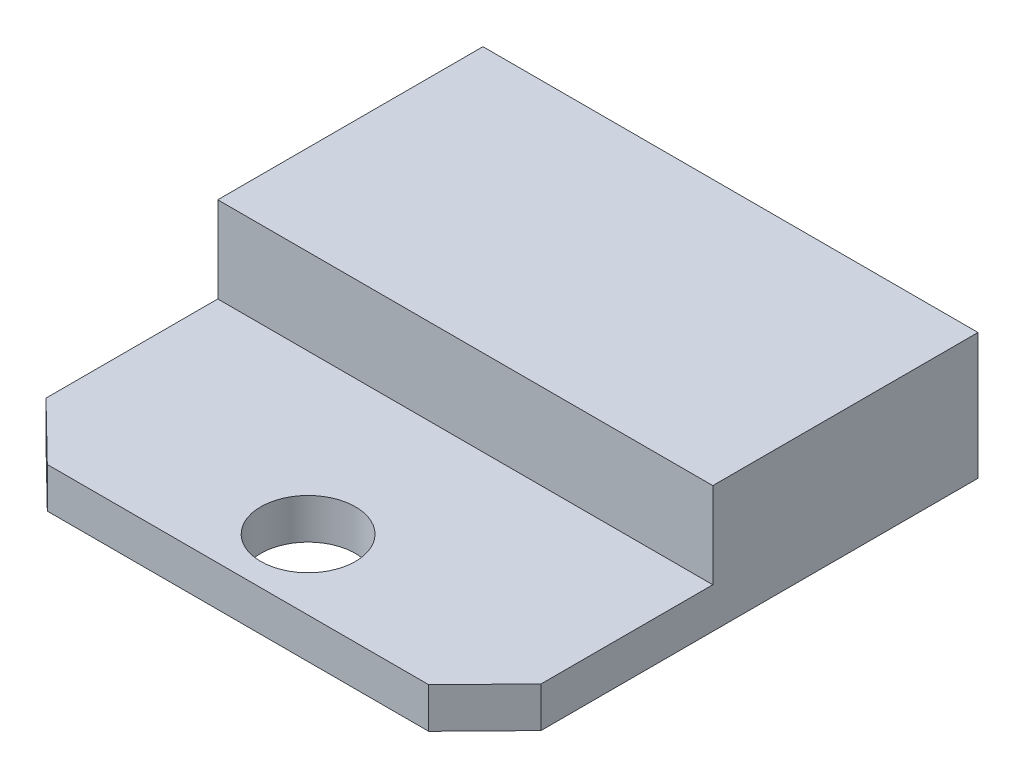
ISO-10303-21;
HEADER;
FILE_DESCRIPTION(('STEP AP214'),'2;1');
FILE_NAME('part.step','',(''),(''),'','','');
FILE_SCHEMA(('AUTOMOTIVE_DESIGN { 1 0 10303 214 1 1 1 1 }'));
ENDSEC;
DATA;
#1=APPLICATION_CONTEXT('core data for automotive mechanical design processes');
#2=APPLICATION_PROTOCOL_DEFINITION('international standard','automotive_design',2000,#1);
#3=PRODUCT_CONTEXT('',#1,'mechanical');
#4=PRODUCT('Part','Part','',(#3));
#5=PRODUCT_RELATED_PRODUCT_CATEGORY('part','',(#4));
#6=PRODUCT_DEFINITION_FORMATION('','',#4);
#7=PRODUCT_DEFINITION_CONTEXT('part definition',#1,'design');
#8=PRODUCT_DEFINITION('design','',#6,#7);
#9=PRODUCT_DEFINITION_SHAPE('','',#8);
#10=(LENGTH_UNIT() NAMED_UNIT(*) SI_UNIT(.MILLI.,.METRE.));
#11=(NAMED_UNIT(*) PLANE_ANGLE_UNIT() SI_UNIT($,.RADIAN.));
#12=(NAMED_UNIT(*) SI_UNIT($,.STERADIAN.) SOLID_ANGLE_UNIT());
#13=UNCERTAINTY_MEASURE_WITH_UNIT(LENGTH_MEASURE(1.E-05),#10,'distance_accuracy_value','');
#14=(GEOMETRIC_REPRESENTATION_CONTEXT(3) GLOBAL_UNCERTAINTY_ASSIGNED_CONTEXT((#13)) GLOBAL_UNIT_ASSIGNED_CONTEXT((#10,
#11,#12)) REPRESENTATION_CONTEXT('',''));
#15=CARTESIAN_POINT('',(0.,0.,0.));
#16=DIRECTION('',(0.,0.,1.));
#17=DIRECTION('',(1.,0.,0.));
#18=AXIS2_PLACEMENT_3D('',#15,#16,#17);
#19=CARTESIAN_POINT('',(-10.7517023594464,1.6,10.9992495701912));
#20=DIRECTION('',(-0.699013941997843,0.,0.71510804001398));
#21=DIRECTION('',(0.71510804001398,0.,0.699013941997843));
#22=AXIS2_PLACEMENT_3D('',#19,#20,#21);
#23=PLANE('',#22);
#24=DIRECTION('',(-0.71510804001398,0.,-0.699013941997843));
#25=VECTOR('',#24,1.);
#26=CARTESIAN_POINT('',(-10.7517023594464,0.,10.9992495701912));
#27=LINE('',#26,#25);
#28=CARTESIAN_POINT('',(-7.10395726533149,0.,14.5648991433532));
#29=VERTEX_POINT('',#28);
#30=CARTESIAN_POINT('',(-9.40576126860046,0.,12.3148991433532));
#31=VERTEX_POINT('',#30);
#32=EDGE_CURVE('E128',#29,#31,#27,.T.);
#33=ORIENTED_EDGE('',*,*,#32,.F.);
#34=DIRECTION('',(0.,-1.,0.));
#35=VECTOR('',#34,1.);
#36=CARTESIAN_POINT('',(-7.10395726533149,1.6,14.5648991433532));
#37=LINE('',#36,#35);
#38=CARTESIAN_POINT('',(-7.10395726533149,1.6,14.5648991433532));
#39=VERTEX_POINT('',#38);
#40=EDGE_CURVE('E11',#39,#29,#37,.T.);
#41=ORIENTED_EDGE('',*,*,#40,.F.);
#42=DIRECTION('',(-0.71510804001398,0.,-0.699013941997843));
#43=VECTOR('',#42,1.);
#44=CARTESIAN_POINT('',(-10.7517023594464,1.6,10.9992495701912));
#45=LINE('',#44,#43);
#46=CARTESIAN_POINT('',(-9.40576126860046,1.6,12.3148991433532));
#47=VERTEX_POINT('',#46);
#48=EDGE_CURVE('E181',#39,#47,#45,.T.);
#49=ORIENTED_EDGE('',*,*,#48,.T.);
#50=DIRECTION('',(0.,-1.,0.));
#51=VECTOR('',#50,1.);
#52=CARTESIAN_POINT('',(-9.40576126860046,1.6,12.3148991433532));
#53=LINE('',#52,#51);
#54=EDGE_CURVE('E57',#47,#31,#53,.T.);
#55=ORIENTED_EDGE('',*,*,#54,.T.);
#56=EDGE_LOOP('',(#33,#41,#49,#55));
#57=FACE_BOUND('',#56,.T.);
#58=ADVANCED_FACE('F39',(#57),#23,.T.);
#59=CARTESIAN_POINT('',(0.,1.6,14.5648991433532));
#60=DIRECTION('',(0.,0.,1.));
#61=DIRECTION('',(1.,0.,0.));
#62=AXIS2_PLACEMENT_3D('',#59,#60,#61);
#63=PLANE('',#62);
#64=DIRECTION('',(-1.,0.,0.));
#65=VECTOR('',#64,1.);
#66=CARTESIAN_POINT('',(0.,0.,14.5648991433532));
#67=LINE('',#66,#65);
#68=CARTESIAN_POINT('',(7.99604273466851,0.,14.5648991433532));
#69=VERTEX_POINT('',#68);
#70=EDGE_CURVE('E132',#69,#29,#67,.T.);
#71=ORIENTED_EDGE('',*,*,#70,.F.);
#72=DIRECTION('',(0.,-1.,0.));
#73=VECTOR('',#72,1.);
#74=CARTESIAN_POINT('',(7.99604273466851,1.6,14.5648991433532));
#75=LINE('',#74,#73);
#76=CARTESIAN_POINT('',(7.99604273466851,1.6,14.5648991433532));
#77=VERTEX_POINT('',#76);
#78=EDGE_CURVE('E49',#77,#69,#75,.T.);
#79=ORIENTED_EDGE('',*,*,#78,.F.);
#80=DIRECTION('',(-1.,0.,0.));
#81=VECTOR('',#80,1.);
#82=CARTESIAN_POINT('',(0.,1.6,14.5648991433532));
#83=LINE('',#82,#81);
#84=EDGE_CURVE('E106',#77,#39,#83,.T.);
#85=ORIENTED_EDGE('',*,*,#84,.T.);
#86=ORIENTED_EDGE('',*,*,#40,.T.);
#87=EDGE_LOOP('',(#71,#79,#85,#86));
#88=FACE_BOUND('',#87,.T.);
#89=ADVANCED_FACE('F150',(#88),#63,.T.);
#90=CARTESIAN_POINT('',(11.3716056029523,1.6,11.1097857390284));
#91=DIRECTION('',(0.71529329015638,0.,0.698824376404587));
#92=DIRECTION('',(0.698824376404587,0.,-0.71529329015638));
#93=AXIS2_PLACEMENT_3D('',#90,#91,#92);
#94=PLANE('',#93);
#95=DIRECTION('',(-0.698824376404587,0.,0.71529329015638));
#96=VECTOR('',#95,1.);
#97=CARTESIAN_POINT('',(11.3716056029523,0.,11.1097857390284));
#98=LINE('',#97,#96);
#99=CARTESIAN_POINT('',(10.1942387313995,0.,12.3148991433532));
#100=VERTEX_POINT('',#99);
#101=EDGE_CURVE('E95',#100,#69,#98,.T.);
#102=ORIENTED_EDGE('',*,*,#101,.F.);
#103=DIRECTION('',(0.,-1.,0.));
#104=VECTOR('',#103,1.);
#105=CARTESIAN_POINT('',(10.1942387313995,1.6,12.3148991433532));
#106=LINE('',#105,#104);
#107=CARTESIAN_POINT('',(10.1942387313995,1.6,12.3148991433532));
#108=VERTEX_POINT('',#107);
#109=EDGE_CURVE('E75',#108,#100,#106,.T.);
#110=ORIENTED_EDGE('',*,*,#109,.F.);
#111=DIRECTION('',(-0.698824376404587,0.,0.71529329015638));
#112=VECTOR('',#111,1.);
#113=CARTESIAN_POINT('',(11.3716056029523,1.6,11.1097857390284));
#114=LINE('',#113,#112);
#115=EDGE_CURVE('E93',#108,#77,#114,.T.);
#116=ORIENTED_EDGE('',*,*,#115,.T.);
#117=ORIENTED_EDGE('',*,*,#78,.T.);
#118=EDGE_LOOP('',(#102,#110,#116,#117));
#119=FACE_BOUND('',#118,.T.);
#120=ADVANCED_FACE('F92',(#119),#94,.T.);
#121=CARTESIAN_POINT('',(10.1942387313995,1.6,0.));
#122=DIRECTION('',(1.,0.,0.));
#123=DIRECTION('',(0.,0.,-1.));
#124=AXIS2_PLACEMENT_3D('',#121,#122,#123);
#125=PLANE('',#124);
#126=DIRECTION('',(0.,0.,1.));
#127=VECTOR('',#126,1.);
#128=CARTESIAN_POINT('',(10.1942387313995,0.,0.));
#129=LINE('',#128,#127);
#130=CARTESIAN_POINT('',(10.1942387313995,0.,-4.98510085664682));
#131=VERTEX_POINT('',#130);
#132=EDGE_CURVE('E138',#131,#100,#129,.T.);
#133=ORIENTED_EDGE('',*,*,#132,.F.);
#134=DIRECTION('',(0.,-1.,0.));
#135=VECTOR('',#134,1.);
#136=CARTESIAN_POINT('',(10.1942387313995,5.,-4.98510085664682));
#137=LINE('',#136,#135);
#138=CARTESIAN_POINT('',(10.1942387313995,5.,-4.98510085664682));
#139=VERTEX_POINT('',#138);
#140=EDGE_CURVE('E129',#139,#131,#137,.T.);
#141=ORIENTED_EDGE('',*,*,#140,.F.);
#142=DIRECTION('',(0.,0.,1.));
#143=VECTOR('',#142,1.);
#144=CARTESIAN_POINT('',(10.1942387313995,5.,0.));
#145=LINE('',#144,#143);
#146=CARTESIAN_POINT('',(10.1942387313995,5.,5.51489914335318));
#147=VERTEX_POINT('',#146);
#148=EDGE_CURVE('E202',#139,#147,#145,.T.);
#149=ORIENTED_EDGE('',*,*,#148,.T.);
#150=DIRECTION('',(0.,-1.,0.));
#151=VECTOR('',#150,1.);
#152=CARTESIAN_POINT('',(10.1942387313995,5.,5.51489914335318));
#153=LINE('',#152,#151);
#154=CARTESIAN_POINT('',(10.1942387313995,1.6,5.51489914335318));
#155=VERTEX_POINT('',#154);
#156=EDGE_CURVE('E113',#147,#155,#153,.T.);
#157=ORIENTED_EDGE('',*,*,#156,.T.);
#158=DIRECTION('',(0.,0.,1.));
#159=VECTOR('',#158,1.);
#160=CARTESIAN_POINT('',(10.1942387313995,1.6,0.));
#161=LINE('',#160,#159);
#162=EDGE_CURVE('E103',#155,#108,#161,.T.);
#163=ORIENTED_EDGE('',*,*,#162,.T.);
#164=ORIENTED_EDGE('',*,*,#109,.T.);
#165=EDGE_LOOP('',(#133,#141,#149,#157,#163,#164));
#166=FACE_BOUND('',#165,.T.);
#167=ADVANCED_FACE('F110',(#166),#125,.T.);
#168=CARTESIAN_POINT('',(0.446042734668507,1.6,11.7898991433532));
#169=DIRECTION('',(0.,-1.,0.));
#170=DIRECTION('',(0.,0.,-1.));
#171=AXIS2_PLACEMENT_3D('',#168,#169,#170);
#172=CYLINDRICAL_SURFACE('',#171,1.875);
#173=CARTESIAN_POINT('',(0.446042734668507,1.6,11.7898991433532));
#174=DIRECTION('',(0.,1.,0.));
#175=DIRECTION('',(0.,0.,1.));
#176=AXIS2_PLACEMENT_3D('',#173,#174,#175);
#177=CIRCLE('',#176,1.875);
#178=CARTESIAN_POINT('',(0.446042734668507,1.6,13.6648991433532));
#179=VERTEX_POINT('',#178);
#180=EDGE_CURVE('E145',#179,#179,#177,.T.);
#181=ORIENTED_EDGE('',*,*,#180,.T.);
#182=EDGE_LOOP('',(#181));
#183=FACE_BOUND('',#182,.T.);
#184=CARTESIAN_POINT('',(0.446042734668507,0.,11.7898991433532));
#185=DIRECTION('',(0.,1.,0.));
#186=DIRECTION('',(0.,0.,1.));
#187=AXIS2_PLACEMENT_3D('',#184,#185,#186);
#188=CIRCLE('',#187,1.875);
#189=CARTESIAN_POINT('',(0.446042734668507,0.,13.6648991433532));
#190=VERTEX_POINT('',#189);
#191=EDGE_CURVE('E124',#190,#190,#188,.T.);
#192=ORIENTED_EDGE('',*,*,#191,.F.);
#193=EDGE_LOOP('',(#192));
#194=FACE_BOUND('',#193,.T.);
#195=ADVANCED_FACE('F41',(#183,#194),#172,.F.);
#196=CARTESIAN_POINT('',(-9.40576126860046,1.6,0.));
#197=DIRECTION('',(-1.,0.,0.));
#198=DIRECTION('',(0.,0.,1.));
#199=AXIS2_PLACEMENT_3D('',#196,#197,#198);
#200=PLANE('',#199);
#201=DIRECTION('',(0.,0.,-1.));
#202=VECTOR('',#201,1.);
#203=CARTESIAN_POINT('',(-9.40576126860046,0.,0.));
#204=LINE('',#203,#202);
#205=CARTESIAN_POINT('',(-9.40576126860046,0.,-4.98510085664682));
#206=VERTEX_POINT('',#205);
#207=EDGE_CURVE('E141',#31,#206,#204,.T.);
#208=ORIENTED_EDGE('',*,*,#207,.F.);
#209=ORIENTED_EDGE('',*,*,#54,.F.);
#210=DIRECTION('',(0.,0.,-1.));
#211=VECTOR('',#210,1.);
#212=CARTESIAN_POINT('',(-9.40576126860046,1.6,0.));
#213=LINE('',#212,#211);
#214=CARTESIAN_POINT('',(-9.40576126860046,1.6,5.51489914335318));
#215=VERTEX_POINT('',#214);
#216=EDGE_CURVE('E118',#47,#215,#213,.T.);
#217=ORIENTED_EDGE('',*,*,#216,.T.);
#218=DIRECTION('',(0.,-1.,0.));
#219=VECTOR('',#218,1.);
#220=CARTESIAN_POINT('',(-9.40576126860046,5.,5.51489914335318));
#221=LINE('',#220,#219);
#222=CARTESIAN_POINT('',(-9.40576126860046,5.,5.51489914335318));
#223=VERTEX_POINT('',#222);
#224=EDGE_CURVE('E174',#223,#215,#221,.T.);
#225=ORIENTED_EDGE('',*,*,#224,.F.);
#226=DIRECTION('',(0.,0.,-1.));
#227=VECTOR('',#226,1.);
#228=CARTESIAN_POINT('',(-9.40576126860046,5.,0.));
#229=LINE('',#228,#227);
#230=CARTESIAN_POINT('',(-9.40576126860046,5.,-4.98510085664682));
#231=VERTEX_POINT('',#230);
#232=EDGE_CURVE('E205',#223,#231,#229,.T.);
#233=ORIENTED_EDGE('',*,*,#232,.T.);
#234=DIRECTION('',(0.,-1.,0.));
#235=VECTOR('',#234,1.);
#236=CARTESIAN_POINT('',(-9.40576126860046,5.,-4.98510085664682));
#237=LINE('',#236,#235);
#238=EDGE_CURVE('E170',#231,#206,#237,.T.);
#239=ORIENTED_EDGE('',*,*,#238,.T.);
#240=EDGE_LOOP('',(#208,#209,#217,#225,#233,#239));
#241=FACE_BOUND('',#240,.T.);
#242=ADVANCED_FACE('F187',(#241),#200,.T.);
#243=CARTESIAN_POINT('',(0.,1.6,0.));
#244=DIRECTION('',(0.,1.,0.));
#245=DIRECTION('',(0.,0.,1.));
#246=AXIS2_PLACEMENT_3D('',#243,#244,#245);
#247=PLANE('',#246);
#248=ORIENTED_EDGE('',*,*,#180,.F.);
#249=EDGE_LOOP('',(#248));
#250=FACE_BOUND('',#249,.T.);
#251=ORIENTED_EDGE('',*,*,#48,.F.);
#252=ORIENTED_EDGE('',*,*,#84,.F.);
#253=ORIENTED_EDGE('',*,*,#115,.F.);
#254=ORIENTED_EDGE('',*,*,#162,.F.);
#255=DIRECTION('',(1.,0.,0.));
#256=VECTOR('',#255,1.);
#257=CARTESIAN_POINT('',(0.,1.6,5.51489914335318));
#258=LINE('',#257,#256);
#259=EDGE_CURVE('E115',#215,#155,#258,.T.);
#260=ORIENTED_EDGE('',*,*,#259,.F.);
#261=ORIENTED_EDGE('',*,*,#216,.F.);
#262=EDGE_LOOP('',(#251,#252,#253,#254,#260,#261));
#263=FACE_BOUND('',#262,.T.);
#264=ADVANCED_FACE('F102',(#250,#263),#247,.T.);
#265=CARTESIAN_POINT('',(0.,0.,0.));
#266=DIRECTION('',(0.,1.,0.));
#267=DIRECTION('',(0.,0.,1.));
#268=AXIS2_PLACEMENT_3D('',#265,#266,#267);
#269=PLANE('',#268);
#270=ORIENTED_EDGE('',*,*,#191,.T.);
#271=EDGE_LOOP('',(#270));
#272=FACE_BOUND('',#271,.T.);
#273=ORIENTED_EDGE('',*,*,#32,.T.);
#274=ORIENTED_EDGE('',*,*,#207,.T.);
#275=DIRECTION('',(1.,0.,0.));
#276=VECTOR('',#275,1.);
#277=CARTESIAN_POINT('',(0.,0.,-4.98510085664682));
#278=LINE('',#277,#276);
#279=EDGE_CURVE('E156',#206,#131,#278,.T.);
#280=ORIENTED_EDGE('',*,*,#279,.T.);
#281=ORIENTED_EDGE('',*,*,#132,.T.);
#282=ORIENTED_EDGE('',*,*,#101,.T.);
#283=ORIENTED_EDGE('',*,*,#70,.T.);
#284=EDGE_LOOP('',(#273,#274,#280,#281,#282,#283));
#285=FACE_BOUND('',#284,.T.);
#286=ADVANCED_FACE('F152',(#272,#285),#269,.F.);
#287=CARTESIAN_POINT('',(0.,5.,5.51489914335318));
#288=DIRECTION('',(0.,0.,-1.));
#289=DIRECTION('',(-1.,0.,0.));
#290=AXIS2_PLACEMENT_3D('',#287,#288,#289);
#291=PLANE('',#290);
#292=ORIENTED_EDGE('',*,*,#224,.T.);
#293=ORIENTED_EDGE('',*,*,#259,.T.);
#294=ORIENTED_EDGE('',*,*,#156,.F.);
#295=DIRECTION('',(1.,0.,0.));
#296=VECTOR('',#295,1.);
#297=CARTESIAN_POINT('',(0.,5.,5.51489914335318));
#298=LINE('',#297,#296);
#299=EDGE_CURVE('E194',#223,#147,#298,.T.);
#300=ORIENTED_EDGE('',*,*,#299,.F.);
#301=EDGE_LOOP('',(#292,#293,#294,#300));
#302=FACE_BOUND('',#301,.T.);
#303=ADVANCED_FACE('F192',(#302),#291,.F.);
#304=CARTESIAN_POINT('',(0.,5.,-4.98510085664682));
#305=DIRECTION('',(0.,0.,-1.));
#306=DIRECTION('',(-1.,0.,0.));
#307=AXIS2_PLACEMENT_3D('',#304,#305,#306);
#308=PLANE('',#307);
#309=ORIENTED_EDGE('',*,*,#279,.F.);
#310=ORIENTED_EDGE('',*,*,#238,.F.);
#311=DIRECTION('',(1.,0.,0.));
#312=VECTOR('',#311,1.);
#313=CARTESIAN_POINT('',(0.,5.,-4.98510085664682));
#314=LINE('',#313,#312);
#315=EDGE_CURVE('E168',#231,#139,#314,.T.);
#316=ORIENTED_EDGE('',*,*,#315,.T.);
#317=ORIENTED_EDGE('',*,*,#140,.T.);
#318=EDGE_LOOP('',(#309,#310,#316,#317));
#319=FACE_BOUND('',#318,.T.);
#320=ADVANCED_FACE('F165',(#319),#308,.T.);
#321=CARTESIAN_POINT('',(0.,5.,0.));
#322=DIRECTION('',(0.,1.,0.));
#323=DIRECTION('',(0.,0.,1.));
#324=AXIS2_PLACEMENT_3D('',#321,#322,#323);
#325=PLANE('',#324);
#326=ORIENTED_EDGE('',*,*,#148,.F.);
#327=ORIENTED_EDGE('',*,*,#315,.F.);
#328=ORIENTED_EDGE('',*,*,#232,.F.);
#329=ORIENTED_EDGE('',*,*,#299,.T.);
#330=EDGE_LOOP('',(#326,#327,#328,#329));
#331=FACE_BOUND('',#330,.T.);
#332=ADVANCED_FACE('F214',(#331),#325,.T.);
#333=CLOSED_SHELL('',(#58,#89,#120,#167,#195,#242,#264,#286,#303,#320,#332));
#334=MANIFOLD_SOLID_BREP('B2',#333);
#335=ADVANCED_BREP_SHAPE_REPRESENTATION('',(#18,#334),#14);
#336=SHAPE_DEFINITION_REPRESENTATION(#9,#335);
ENDSEC;
END-ISO-10303-21;
